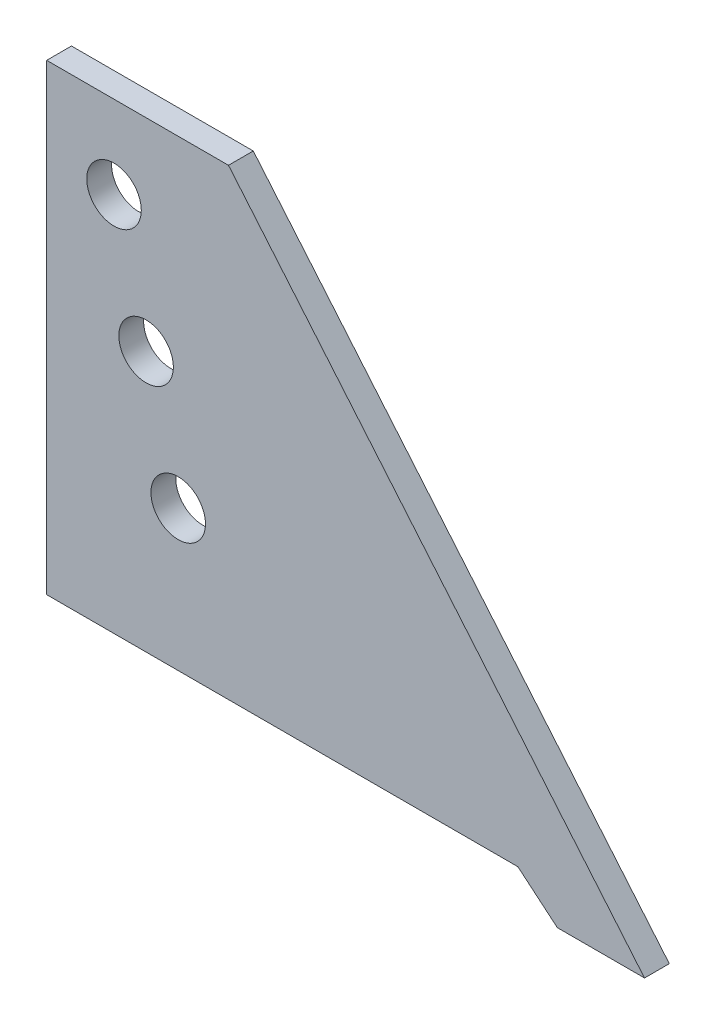
ISO-10303-21;
HEADER;
FILE_DESCRIPTION(('STEP AP214'),'2;1');
FILE_NAME('part.step','',(''),(''),'','','');
FILE_SCHEMA(('AUTOMOTIVE_DESIGN { 1 0 10303 214 1 1 1 1 }'));
ENDSEC;
DATA;
#1=APPLICATION_CONTEXT('core data for automotive mechanical design processes');
#2=APPLICATION_PROTOCOL_DEFINITION('international standard','automotive_design',2000,#1);
#3=PRODUCT_CONTEXT('',#1,'mechanical');
#4=PRODUCT('Part','Part','',(#3));
#5=PRODUCT_RELATED_PRODUCT_CATEGORY('part','',(#4));
#6=PRODUCT_DEFINITION_FORMATION('','',#4);
#7=PRODUCT_DEFINITION_CONTEXT('part definition',#1,'design');
#8=PRODUCT_DEFINITION('design','',#6,#7);
#9=PRODUCT_DEFINITION_SHAPE('','',#8);
#10=(LENGTH_UNIT() NAMED_UNIT(*) SI_UNIT(.MILLI.,.METRE.));
#11=(NAMED_UNIT(*) PLANE_ANGLE_UNIT() SI_UNIT($,.RADIAN.));
#12=(NAMED_UNIT(*) SI_UNIT($,.STERADIAN.) SOLID_ANGLE_UNIT());
#13=UNCERTAINTY_MEASURE_WITH_UNIT(LENGTH_MEASURE(1.E-05),#10,'distance_accuracy_value','');
#14=(GEOMETRIC_REPRESENTATION_CONTEXT(3) GLOBAL_UNCERTAINTY_ASSIGNED_CONTEXT((#13)) GLOBAL_UNIT_ASSIGNED_CONTEXT((#10,
#11,#12)) REPRESENTATION_CONTEXT('',''));
#15=CARTESIAN_POINT('',(0.,0.,0.));
#16=DIRECTION('',(0.,0.,1.));
#17=DIRECTION('',(1.,0.,0.));
#18=AXIS2_PLACEMENT_3D('',#15,#16,#17);
#19=CARTESIAN_POINT('',(72.3459778706374,0.,3.));
#20=DIRECTION('',(0.,1.,0.));
#21=DIRECTION('',(0.,0.,1.));
#22=AXIS2_PLACEMENT_3D('',#19,#20,#21);
#23=PLANE('',#22);
#24=DIRECTION('',(1.,0.,0.));
#25=VECTOR('',#24,1.);
#26=CARTESIAN_POINT('',(72.3459778706374,0.,3.));
#27=LINE('',#26,#25);
#28=CARTESIAN_POINT('',(61.7910835507606,0.,3.));
#29=VERTEX_POINT('',#28);
#30=CARTESIAN_POINT('',(72.3459778706374,0.,3.));
#31=VERTEX_POINT('',#30);
#32=EDGE_CURVE('E82',#29,#31,#27,.T.);
#33=ORIENTED_EDGE('',*,*,#32,.F.);
#34=DIRECTION('',(0.,0.,1.));
#35=VECTOR('',#34,1.);
#36=CARTESIAN_POINT('',(61.7910835507606,0.,0.));
#37=LINE('',#36,#35);
#38=CARTESIAN_POINT('',(61.7910835507606,0.,0.));
#39=VERTEX_POINT('',#38);
#40=EDGE_CURVE('E102',#39,#29,#37,.T.);
#41=ORIENTED_EDGE('',*,*,#40,.F.);
#42=DIRECTION('',(1.,0.,0.));
#43=VECTOR('',#42,1.);
#44=CARTESIAN_POINT('',(72.3459778706374,0.,0.));
#45=LINE('',#44,#43);
#46=CARTESIAN_POINT('',(72.3459778706374,0.,0.));
#47=VERTEX_POINT('',#46);
#48=EDGE_CURVE('E110',#39,#47,#45,.T.);
#49=ORIENTED_EDGE('',*,*,#48,.T.);
#50=DIRECTION('',(0.,0.,-1.));
#51=VECTOR('',#50,1.);
#52=CARTESIAN_POINT('',(72.3459778706374,0.,3.));
#53=LINE('',#52,#51);
#54=EDGE_CURVE('E11',#31,#47,#53,.T.);
#55=ORIENTED_EDGE('',*,*,#54,.F.);
#56=EDGE_LOOP('',(#33,#41,#49,#55));
#57=FACE_BOUND('',#56,.T.);
#58=ADVANCED_FACE('F37',(#57),#23,.F.);
#59=CARTESIAN_POINT('',(22.,60.,3.));
#60=DIRECTION('',(-0.766044443118974,-0.642787609686544,0.));
#61=DIRECTION('',(0.642787609686544,-0.766044443118974,0.));
#62=AXIS2_PLACEMENT_3D('',#59,#60,#61);
#63=PLANE('',#62);
#64=DIRECTION('',(-0.642787609686544,0.766044443118974,0.));
#65=VECTOR('',#64,1.);
#66=CARTESIAN_POINT('',(22.,60.,0.));
#67=LINE('',#66,#65);
#68=CARTESIAN_POINT('',(22.,60.,0.));
#69=VERTEX_POINT('',#68);
#70=EDGE_CURVE('E115',#47,#69,#67,.T.);
#71=ORIENTED_EDGE('',*,*,#70,.T.);
#72=DIRECTION('',(0.,0.,-1.));
#73=VECTOR('',#72,1.);
#74=CARTESIAN_POINT('',(22.,60.,3.));
#75=LINE('',#74,#73);
#76=CARTESIAN_POINT('',(22.,60.,3.));
#77=VERTEX_POINT('',#76);
#78=EDGE_CURVE('E44',#77,#69,#75,.T.);
#79=ORIENTED_EDGE('',*,*,#78,.F.);
#80=DIRECTION('',(-0.642787609686544,0.766044443118974,0.));
#81=VECTOR('',#80,1.);
#82=CARTESIAN_POINT('',(22.,60.,3.));
#83=LINE('',#82,#81);
#84=EDGE_CURVE('E141',#31,#77,#83,.T.);
#85=ORIENTED_EDGE('',*,*,#84,.F.);
#86=ORIENTED_EDGE('',*,*,#54,.T.);
#87=EDGE_LOOP('',(#71,#79,#85,#86));
#88=FACE_BOUND('',#87,.T.);
#89=ADVANCED_FACE('F178',(#88),#63,.F.);
#90=CARTESIAN_POINT('',(0.,60.,3.));
#91=DIRECTION('',(0.,-1.,0.));
#92=DIRECTION('',(0.,0.,-1.));
#93=AXIS2_PLACEMENT_3D('',#90,#91,#92);
#94=PLANE('',#93);
#95=DIRECTION('',(-1.,0.,0.));
#96=VECTOR('',#95,1.);
#97=CARTESIAN_POINT('',(0.,60.,0.));
#98=LINE('',#97,#96);
#99=CARTESIAN_POINT('',(0.,60.,0.));
#100=VERTEX_POINT('',#99);
#101=EDGE_CURVE('E77',#69,#100,#98,.T.);
#102=ORIENTED_EDGE('',*,*,#101,.T.);
#103=DIRECTION('',(0.,0.,-1.));
#104=VECTOR('',#103,1.);
#105=CARTESIAN_POINT('',(0.,60.,3.));
#106=LINE('',#105,#104);
#107=CARTESIAN_POINT('',(0.,60.,3.));
#108=VERTEX_POINT('',#107);
#109=EDGE_CURVE('E130',#108,#100,#106,.T.);
#110=ORIENTED_EDGE('',*,*,#109,.F.);
#111=DIRECTION('',(-1.,0.,0.));
#112=VECTOR('',#111,1.);
#113=CARTESIAN_POINT('',(0.,60.,3.));
#114=LINE('',#113,#112);
#115=EDGE_CURVE('E60',#77,#108,#114,.T.);
#116=ORIENTED_EDGE('',*,*,#115,.F.);
#117=ORIENTED_EDGE('',*,*,#78,.T.);
#118=EDGE_LOOP('',(#102,#110,#116,#117));
#119=FACE_BOUND('',#118,.T.);
#120=ADVANCED_FACE('F132',(#119),#94,.F.);
#121=CARTESIAN_POINT('',(0.,0.,3.));
#122=DIRECTION('',(1.,0.,0.));
#123=DIRECTION('',(0.,0.,-1.));
#124=AXIS2_PLACEMENT_3D('',#121,#122,#123);
#125=PLANE('',#124);
#126=DIRECTION('',(0.,-1.,0.));
#127=VECTOR('',#126,1.);
#128=CARTESIAN_POINT('',(0.,0.,0.));
#129=LINE('',#128,#127);
#130=CARTESIAN_POINT('',(0.,4.,0.));
#131=VERTEX_POINT('',#130);
#132=EDGE_CURVE('E127',#100,#131,#129,.T.);
#133=ORIENTED_EDGE('',*,*,#132,.T.);
#134=DIRECTION('',(0.,0.,1.));
#135=VECTOR('',#134,1.);
#136=CARTESIAN_POINT('',(0.,4.,0.));
#137=LINE('',#136,#135);
#138=CARTESIAN_POINT('',(0.,4.,3.));
#139=VERTEX_POINT('',#138);
#140=EDGE_CURVE('E139',#131,#139,#137,.T.);
#141=ORIENTED_EDGE('',*,*,#140,.T.);
#142=DIRECTION('',(0.,-1.,0.));
#143=VECTOR('',#142,1.);
#144=CARTESIAN_POINT('',(0.,0.,3.));
#145=LINE('',#144,#143);
#146=EDGE_CURVE('E123',#108,#139,#145,.T.);
#147=ORIENTED_EDGE('',*,*,#146,.F.);
#148=ORIENTED_EDGE('',*,*,#109,.T.);
#149=EDGE_LOOP('',(#133,#141,#147,#148));
#150=FACE_BOUND('',#149,.T.);
#151=ADVANCED_FACE('F137',(#150),#125,.F.);
#152=CARTESIAN_POINT('',(0.,0.,3.));
#153=DIRECTION('',(0.,0.,-1.));
#154=DIRECTION('',(-1.,0.,0.));
#155=AXIS2_PLACEMENT_3D('',#152,#153,#154);
#156=PLANE('',#155);
#157=CARTESIAN_POINT('',(15.9131425281419,21.022225211327,3.));
#158=DIRECTION('',(0.,0.,1.));
#159=DIRECTION('',(1.,0.,0.));
#160=AXIS2_PLACEMENT_3D('',#157,#158,#159);
#161=CIRCLE('',#160,3.3);
#162=CARTESIAN_POINT('',(19.2131425281419,21.022225211327,3.));
#163=VERTEX_POINT('',#162);
#164=EDGE_CURVE('E156',#163,#163,#161,.T.);
#165=ORIENTED_EDGE('',*,*,#164,.F.);
#166=EDGE_LOOP('',(#165));
#167=FACE_BOUND('',#166,.T.);
#168=CARTESIAN_POINT('',(12.0308568516041,35.5111126056631,3.));
#169=DIRECTION('',(0.,0.,1.));
#170=DIRECTION('',(1.,0.,0.));
#171=AXIS2_PLACEMENT_3D('',#168,#169,#170);
#172=CIRCLE('',#171,3.3);
#173=CARTESIAN_POINT('',(15.3308568516041,35.5111126056631,3.));
#174=VERTEX_POINT('',#173);
#175=EDGE_CURVE('E150',#174,#174,#172,.T.);
#176=ORIENTED_EDGE('',*,*,#175,.F.);
#177=EDGE_LOOP('',(#176));
#178=FACE_BOUND('',#177,.T.);
#179=CARTESIAN_POINT('',(8.14857117506629,49.9999999999991,3.));
#180=DIRECTION('',(0.,0.,1.));
#181=DIRECTION('',(1.,0.,0.));
#182=AXIS2_PLACEMENT_3D('',#179,#180,#181);
#183=CIRCLE('',#182,3.3);
#184=CARTESIAN_POINT('',(11.4485711750663,49.9999999999991,3.));
#185=VERTEX_POINT('',#184);
#186=EDGE_CURVE('E120',#185,#185,#183,.T.);
#187=ORIENTED_EDGE('',*,*,#186,.F.);
#188=EDGE_LOOP('',(#187));
#189=FACE_BOUND('',#188,.T.);
#190=ORIENTED_EDGE('',*,*,#146,.T.);
#191=DIRECTION('',(-1.,0.,0.));
#192=VECTOR('',#191,1.);
#193=CARTESIAN_POINT('',(0.,4.,3.));
#194=LINE('',#193,#192);
#195=CARTESIAN_POINT('',(57.0240691803837,4.,3.));
#196=VERTEX_POINT('',#195);
#197=EDGE_CURVE('E106',#196,#139,#194,.T.);
#198=ORIENTED_EDGE('',*,*,#197,.F.);
#199=DIRECTION('',(-0.766044443118982,0.642787609686535,0.));
#200=VECTOR('',#199,1.);
#201=CARTESIAN_POINT('',(57.0240691803837,4.,3.));
#202=LINE('',#201,#200);
#203=EDGE_CURVE('E162',#29,#196,#202,.T.);
#204=ORIENTED_EDGE('',*,*,#203,.F.);
#205=ORIENTED_EDGE('',*,*,#32,.T.);
#206=ORIENTED_EDGE('',*,*,#84,.T.);
#207=ORIENTED_EDGE('',*,*,#115,.T.);
#208=EDGE_LOOP('',(#190,#198,#204,#205,#206,#207));
#209=FACE_BOUND('',#208,.T.);
#210=ADVANCED_FACE('F164',(#167,#178,#189,#209),#156,.F.);
#211=CARTESIAN_POINT('',(0.,0.,0.));
#212=DIRECTION('',(0.,0.,-1.));
#213=DIRECTION('',(-1.,0.,0.));
#214=AXIS2_PLACEMENT_3D('',#211,#212,#213);
#215=PLANE('',#214);
#216=DIRECTION('',(-1.,0.,0.));
#217=VECTOR('',#216,1.);
#218=CARTESIAN_POINT('',(0.,4.,0.));
#219=LINE('',#218,#217);
#220=CARTESIAN_POINT('',(57.0240691803837,4.00000000000001,0.));
#221=VERTEX_POINT('',#220);
#222=EDGE_CURVE('E51',#221,#131,#219,.T.);
#223=ORIENTED_EDGE('',*,*,#222,.T.);
#224=ORIENTED_EDGE('',*,*,#132,.F.);
#225=ORIENTED_EDGE('',*,*,#101,.F.);
#226=ORIENTED_EDGE('',*,*,#70,.F.);
#227=ORIENTED_EDGE('',*,*,#48,.F.);
#228=DIRECTION('',(-0.766044443118982,0.642787609686535,0.));
#229=VECTOR('',#228,1.);
#230=CARTESIAN_POINT('',(57.0240691803837,4.,0.));
#231=LINE('',#230,#229);
#232=EDGE_CURVE('E98',#39,#221,#231,.T.);
#233=ORIENTED_EDGE('',*,*,#232,.T.);
#234=EDGE_LOOP('',(#223,#224,#225,#226,#227,#233));
#235=FACE_BOUND('',#234,.T.);
#236=CARTESIAN_POINT('',(15.9131425281419,21.022225211327,0.));
#237=DIRECTION('',(0.,0.,1.));
#238=DIRECTION('',(1.,0.,0.));
#239=AXIS2_PLACEMENT_3D('',#236,#237,#238);
#240=CIRCLE('',#239,3.3);
#241=CARTESIAN_POINT('',(19.2131425281419,21.022225211327,0.));
#242=VERTEX_POINT('',#241);
#243=EDGE_CURVE('E153',#242,#242,#240,.T.);
#244=ORIENTED_EDGE('',*,*,#243,.T.);
#245=EDGE_LOOP('',(#244));
#246=FACE_BOUND('',#245,.T.);
#247=CARTESIAN_POINT('',(12.0308568516041,35.5111126056631,0.));
#248=DIRECTION('',(0.,0.,1.));
#249=DIRECTION('',(1.,0.,0.));
#250=AXIS2_PLACEMENT_3D('',#247,#248,#249);
#251=CIRCLE('',#250,3.3);
#252=CARTESIAN_POINT('',(15.3308568516041,35.5111126056631,0.));
#253=VERTEX_POINT('',#252);
#254=EDGE_CURVE('E147',#253,#253,#251,.T.);
#255=ORIENTED_EDGE('',*,*,#254,.T.);
#256=EDGE_LOOP('',(#255));
#257=FACE_BOUND('',#256,.T.);
#258=CARTESIAN_POINT('',(8.14857117506629,49.9999999999991,0.));
#259=DIRECTION('',(0.,0.,1.));
#260=DIRECTION('',(1.,0.,0.));
#261=AXIS2_PLACEMENT_3D('',#258,#259,#260);
#262=CIRCLE('',#261,3.3);
#263=CARTESIAN_POINT('',(11.4485711750663,49.9999999999991,0.));
#264=VERTEX_POINT('',#263);
#265=EDGE_CURVE('E116',#264,#264,#262,.T.);
#266=ORIENTED_EDGE('',*,*,#265,.T.);
#267=EDGE_LOOP('',(#266));
#268=FACE_BOUND('',#267,.T.);
#269=ADVANCED_FACE('F113',(#235,#246,#257,#268),#215,.T.);
#270=CARTESIAN_POINT('',(8.14857117506629,49.9999999999991,3.));
#271=DIRECTION('',(0.,0.,1.));
#272=DIRECTION('',(1.,0.,0.));
#273=AXIS2_PLACEMENT_3D('',#270,#271,#272);
#274=CYLINDRICAL_SURFACE('',#273,3.3);
#275=ORIENTED_EDGE('',*,*,#265,.F.);
#276=EDGE_LOOP('',(#275));
#277=FACE_BOUND('',#276,.T.);
#278=ORIENTED_EDGE('',*,*,#186,.T.);
#279=EDGE_LOOP('',(#278));
#280=FACE_BOUND('',#279,.T.);
#281=ADVANCED_FACE('F191',(#277,#280),#274,.F.);
#282=CARTESIAN_POINT('',(12.0308568516041,35.5111126056631,3.));
#283=DIRECTION('',(0.,0.,1.));
#284=DIRECTION('',(1.,0.,0.));
#285=AXIS2_PLACEMENT_3D('',#282,#283,#284);
#286=CYLINDRICAL_SURFACE('',#285,3.3);
#287=ORIENTED_EDGE('',*,*,#254,.F.);
#288=EDGE_LOOP('',(#287));
#289=FACE_BOUND('',#288,.T.);
#290=ORIENTED_EDGE('',*,*,#175,.T.);
#291=EDGE_LOOP('',(#290));
#292=FACE_BOUND('',#291,.T.);
#293=ADVANCED_FACE('F174',(#289,#292),#286,.F.);
#294=CARTESIAN_POINT('',(15.9131425281419,21.022225211327,3.));
#295=DIRECTION('',(0.,0.,1.));
#296=DIRECTION('',(1.,0.,0.));
#297=AXIS2_PLACEMENT_3D('',#294,#295,#296);
#298=CYLINDRICAL_SURFACE('',#297,3.3);
#299=ORIENTED_EDGE('',*,*,#243,.F.);
#300=EDGE_LOOP('',(#299));
#301=FACE_BOUND('',#300,.T.);
#302=ORIENTED_EDGE('',*,*,#164,.T.);
#303=EDGE_LOOP('',(#302));
#304=FACE_BOUND('',#303,.T.);
#305=ADVANCED_FACE('F167',(#301,#304),#298,.F.);
#306=CARTESIAN_POINT('',(0.,4.,0.));
#307=DIRECTION('',(0.,1.,0.));
#308=DIRECTION('',(0.,0.,1.));
#309=AXIS2_PLACEMENT_3D('',#306,#307,#308);
#310=PLANE('',#309);
#311=ORIENTED_EDGE('',*,*,#197,.T.);
#312=ORIENTED_EDGE('',*,*,#140,.F.);
#313=ORIENTED_EDGE('',*,*,#222,.F.);
#314=DIRECTION('',(0.,0.,1.));
#315=VECTOR('',#314,1.);
#316=CARTESIAN_POINT('',(57.0240691803837,4.,0.));
#317=LINE('',#316,#315);
#318=EDGE_CURVE('E103',#221,#196,#317,.T.);
#319=ORIENTED_EDGE('',*,*,#318,.T.);
#320=EDGE_LOOP('',(#311,#312,#313,#319));
#321=FACE_BOUND('',#320,.T.);
#322=ADVANCED_FACE('F165',(#321),#310,.F.);
#323=CARTESIAN_POINT('',(57.0240691803837,4.,0.));
#324=DIRECTION('',(0.642787609686535,0.766044443118982,0.));
#325=DIRECTION('',(-0.766044443118982,0.642787609686535,0.));
#326=AXIS2_PLACEMENT_3D('',#323,#324,#325);
#327=PLANE('',#326);
#328=ORIENTED_EDGE('',*,*,#203,.T.);
#329=ORIENTED_EDGE('',*,*,#318,.F.);
#330=ORIENTED_EDGE('',*,*,#232,.F.);
#331=ORIENTED_EDGE('',*,*,#40,.T.);
#332=EDGE_LOOP('',(#328,#329,#330,#331));
#333=FACE_BOUND('',#332,.T.);
#334=ADVANCED_FACE('F101',(#333),#327,.F.);
#335=CLOSED_SHELL('',(#58,#89,#120,#151,#210,#269,#281,#293,#305,#322,#334));
#336=MANIFOLD_SOLID_BREP('B2',#335);
#337=ADVANCED_BREP_SHAPE_REPRESENTATION('',(#18,#336),#14);
#338=SHAPE_DEFINITION_REPRESENTATION(#9,#337);
ENDSEC;
END-ISO-10303-21;
